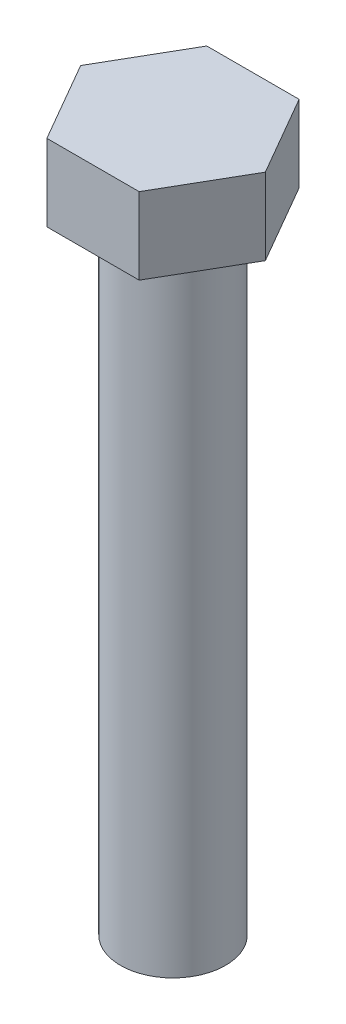
ISO-10303-21;
HEADER;
FILE_DESCRIPTION(('STEP AP214'),'2;1');
FILE_NAME('part.step','',(''),(''),'','','');
FILE_SCHEMA(('AUTOMOTIVE_DESIGN { 1 0 10303 214 1 1 1 1 }'));
ENDSEC;
DATA;
#1=APPLICATION_CONTEXT('core data for automotive mechanical design processes');
#2=APPLICATION_PROTOCOL_DEFINITION('international standard','automotive_design',2000,#1);
#3=PRODUCT_CONTEXT('',#1,'mechanical');
#4=PRODUCT('Part','Part','',(#3));
#5=PRODUCT_RELATED_PRODUCT_CATEGORY('part','',(#4));
#6=PRODUCT_DEFINITION_FORMATION('','',#4);
#7=PRODUCT_DEFINITION_CONTEXT('part definition',#1,'design');
#8=PRODUCT_DEFINITION('design','',#6,#7);
#9=PRODUCT_DEFINITION_SHAPE('','',#8);
#10=(LENGTH_UNIT() NAMED_UNIT(*) SI_UNIT(.MILLI.,.METRE.));
#11=(NAMED_UNIT(*) PLANE_ANGLE_UNIT() SI_UNIT($,.RADIAN.));
#12=(NAMED_UNIT(*) SI_UNIT($,.STERADIAN.) SOLID_ANGLE_UNIT());
#13=UNCERTAINTY_MEASURE_WITH_UNIT(LENGTH_MEASURE(1.E-05),#10,'distance_accuracy_value','');
#14=(GEOMETRIC_REPRESENTATION_CONTEXT(3) GLOBAL_UNCERTAINTY_ASSIGNED_CONTEXT((#13)) GLOBAL_UNIT_ASSIGNED_CONTEXT((#10,
#11,#12)) REPRESENTATION_CONTEXT('',''));
#15=CARTESIAN_POINT('',(0.,0.,0.));
#16=DIRECTION('',(0.,0.,1.));
#17=DIRECTION('',(1.,0.,0.));
#18=AXIS2_PLACEMENT_3D('',#15,#16,#17);
#19=CARTESIAN_POINT('',(-2.1975,3.65,3.80618164963261));
#20=DIRECTION('',(0.,0.,-1.));
#21=DIRECTION('',(-1.,0.,0.));
#22=AXIS2_PLACEMENT_3D('',#19,#20,#21);
#23=PLANE('',#22);
#24=DIRECTION('',(1.,0.,0.));
#25=VECTOR('',#24,1.);
#26=CARTESIAN_POINT('',(-2.1975,0.,3.80618164963261));
#27=LINE('',#26,#25);
#28=CARTESIAN_POINT('',(-2.1975,0.,3.80618164963261));
#29=VERTEX_POINT('',#28);
#30=CARTESIAN_POINT('',(2.1975,0.,3.80618164963261));
#31=VERTEX_POINT('',#30);
#32=EDGE_CURVE('E120',#29,#31,#27,.T.);
#33=ORIENTED_EDGE('',*,*,#32,.T.);
#34=DIRECTION('',(0.,-1.,0.));
#35=VECTOR('',#34,1.);
#36=CARTESIAN_POINT('',(2.1975,3.65,3.80618164963261));
#37=LINE('',#36,#35);
#38=CARTESIAN_POINT('',(2.1975,3.65,3.80618164963261));
#39=VERTEX_POINT('',#38);
#40=EDGE_CURVE('E37',#39,#31,#37,.T.);
#41=ORIENTED_EDGE('',*,*,#40,.F.);
#42=DIRECTION('',(1.,0.,0.));
#43=VECTOR('',#42,1.);
#44=CARTESIAN_POINT('',(-2.1975,3.65,3.80618164963261));
#45=LINE('',#44,#43);
#46=CARTESIAN_POINT('',(-2.1975,3.65,3.80618164963261));
#47=VERTEX_POINT('',#46);
#48=EDGE_CURVE('E131',#47,#39,#45,.T.);
#49=ORIENTED_EDGE('',*,*,#48,.F.);
#50=DIRECTION('',(0.,-1.,0.));
#51=VECTOR('',#50,1.);
#52=CARTESIAN_POINT('',(-2.1975,3.65,3.80618164963261));
#53=LINE('',#52,#51);
#54=EDGE_CURVE('E116',#47,#29,#53,.T.);
#55=ORIENTED_EDGE('',*,*,#54,.T.);
#56=EDGE_LOOP('',(#33,#41,#49,#55));
#57=FACE_BOUND('',#56,.T.);
#58=ADVANCED_FACE('F34',(#57),#23,.F.);
#59=CARTESIAN_POINT('',(2.1975,3.65,3.80618164963261));
#60=DIRECTION('',(-0.866025403784439,0.,-0.5));
#61=DIRECTION('',(-0.5,0.,0.866025403784439));
#62=AXIS2_PLACEMENT_3D('',#59,#60,#61);
#63=PLANE('',#62);
#64=DIRECTION('',(0.5,0.,-0.866025403784439));
#65=VECTOR('',#64,1.);
#66=CARTESIAN_POINT('',(2.1975,0.,3.80618164963261));
#67=LINE('',#66,#65);
#68=CARTESIAN_POINT('',(4.395,0.,0.));
#69=VERTEX_POINT('',#68);
#70=EDGE_CURVE('E123',#31,#69,#67,.T.);
#71=ORIENTED_EDGE('',*,*,#70,.T.);
#72=DIRECTION('',(0.,-1.,0.));
#73=VECTOR('',#72,1.);
#74=CARTESIAN_POINT('',(4.395,3.65,0.));
#75=LINE('',#74,#73);
#76=CARTESIAN_POINT('',(4.395,3.65,0.));
#77=VERTEX_POINT('',#76);
#78=EDGE_CURVE('E134',#77,#69,#75,.T.);
#79=ORIENTED_EDGE('',*,*,#78,.F.);
#80=DIRECTION('',(0.5,0.,-0.866025403784439));
#81=VECTOR('',#80,1.);
#82=CARTESIAN_POINT('',(2.1975,3.65,3.80618164963261));
#83=LINE('',#82,#81);
#84=EDGE_CURVE('E89',#39,#77,#83,.T.);
#85=ORIENTED_EDGE('',*,*,#84,.F.);
#86=ORIENTED_EDGE('',*,*,#40,.T.);
#87=EDGE_LOOP('',(#71,#79,#85,#86));
#88=FACE_BOUND('',#87,.T.);
#89=ADVANCED_FACE('F139',(#88),#63,.F.);
#90=CARTESIAN_POINT('',(4.395,3.65,0.));
#91=DIRECTION('',(-0.866025403784438,0.,0.5));
#92=DIRECTION('',(0.5,0.,0.866025403784439));
#93=AXIS2_PLACEMENT_3D('',#90,#91,#92);
#94=PLANE('',#93);
#95=DIRECTION('',(-0.5,0.,-0.866025403784438));
#96=VECTOR('',#95,1.);
#97=CARTESIAN_POINT('',(4.395,0.,0.));
#98=LINE('',#97,#96);
#99=CARTESIAN_POINT('',(2.1975,0.,-3.80618164963261));
#100=VERTEX_POINT('',#99);
#101=EDGE_CURVE('E126',#69,#100,#98,.T.);
#102=ORIENTED_EDGE('',*,*,#101,.T.);
#103=DIRECTION('',(0.,-1.,0.));
#104=VECTOR('',#103,1.);
#105=CARTESIAN_POINT('',(2.1975,3.65,-3.80618164963261));
#106=LINE('',#105,#104);
#107=CARTESIAN_POINT('',(2.1975,3.65,-3.80618164963261));
#108=VERTEX_POINT('',#107);
#109=EDGE_CURVE('E111',#108,#100,#106,.T.);
#110=ORIENTED_EDGE('',*,*,#109,.F.);
#111=DIRECTION('',(-0.5,0.,-0.866025403784438));
#112=VECTOR('',#111,1.);
#113=CARTESIAN_POINT('',(4.395,3.65,0.));
#114=LINE('',#113,#112);
#115=EDGE_CURVE('E102',#77,#108,#114,.T.);
#116=ORIENTED_EDGE('',*,*,#115,.F.);
#117=ORIENTED_EDGE('',*,*,#78,.T.);
#118=EDGE_LOOP('',(#102,#110,#116,#117));
#119=FACE_BOUND('',#118,.T.);
#120=ADVANCED_FACE('F145',(#119),#94,.F.);
#121=CARTESIAN_POINT('',(2.1975,3.65,-3.80618164963261));
#122=DIRECTION('',(0.,0.,1.));
#123=DIRECTION('',(1.,0.,0.));
#124=AXIS2_PLACEMENT_3D('',#121,#122,#123);
#125=PLANE('',#124);
#126=DIRECTION('',(-1.,0.,0.));
#127=VECTOR('',#126,1.);
#128=CARTESIAN_POINT('',(2.1975,0.,-3.80618164963261));
#129=LINE('',#128,#127);
#130=CARTESIAN_POINT('',(-2.1975,0.,-3.80618164963261));
#131=VERTEX_POINT('',#130);
#132=EDGE_CURVE('E110',#100,#131,#129,.T.);
#133=ORIENTED_EDGE('',*,*,#132,.T.);
#134=DIRECTION('',(0.,-1.,0.));
#135=VECTOR('',#134,1.);
#136=CARTESIAN_POINT('',(-2.1975,3.65,-3.80618164963261));
#137=LINE('',#136,#135);
#138=CARTESIAN_POINT('',(-2.1975,3.65,-3.80618164963261));
#139=VERTEX_POINT('',#138);
#140=EDGE_CURVE('E107',#139,#131,#137,.T.);
#141=ORIENTED_EDGE('',*,*,#140,.F.);
#142=DIRECTION('',(-1.,0.,0.));
#143=VECTOR('',#142,1.);
#144=CARTESIAN_POINT('',(2.1975,3.65,-3.80618164963261));
#145=LINE('',#144,#143);
#146=EDGE_CURVE('E96',#108,#139,#145,.T.);
#147=ORIENTED_EDGE('',*,*,#146,.F.);
#148=ORIENTED_EDGE('',*,*,#109,.T.);
#149=EDGE_LOOP('',(#133,#141,#147,#148));
#150=FACE_BOUND('',#149,.T.);
#151=ADVANCED_FACE('F108',(#150),#125,.F.);
#152=CARTESIAN_POINT('',(-2.1975,3.65,-3.80618164963261));
#153=DIRECTION('',(0.866025403784439,0.,0.5));
#154=DIRECTION('',(0.5,0.,-0.866025403784439));
#155=AXIS2_PLACEMENT_3D('',#152,#153,#154);
#156=PLANE('',#155);
#157=DIRECTION('',(-0.5,0.,0.866025403784439));
#158=VECTOR('',#157,1.);
#159=CARTESIAN_POINT('',(-2.1975,0.,-3.80618164963261));
#160=LINE('',#159,#158);
#161=CARTESIAN_POINT('',(-4.395,0.,0.));
#162=VERTEX_POINT('',#161);
#163=EDGE_CURVE('E74',#131,#162,#160,.T.);
#164=ORIENTED_EDGE('',*,*,#163,.T.);
#165=DIRECTION('',(0.,-1.,0.));
#166=VECTOR('',#165,1.);
#167=CARTESIAN_POINT('',(-4.395,3.65,0.));
#168=LINE('',#167,#166);
#169=CARTESIAN_POINT('',(-4.395,3.65,0.));
#170=VERTEX_POINT('',#169);
#171=EDGE_CURVE('E112',#170,#162,#168,.T.);
#172=ORIENTED_EDGE('',*,*,#171,.F.);
#173=DIRECTION('',(-0.5,0.,0.866025403784439));
#174=VECTOR('',#173,1.);
#175=CARTESIAN_POINT('',(-2.1975,3.65,-3.80618164963261));
#176=LINE('',#175,#174);
#177=EDGE_CURVE('E100',#139,#170,#176,.T.);
#178=ORIENTED_EDGE('',*,*,#177,.F.);
#179=ORIENTED_EDGE('',*,*,#140,.T.);
#180=EDGE_LOOP('',(#164,#172,#178,#179));
#181=FACE_BOUND('',#180,.T.);
#182=ADVANCED_FACE('F114',(#181),#156,.F.);
#183=CARTESIAN_POINT('',(-4.395,3.65,0.));
#184=DIRECTION('',(0.866025403784438,0.,-0.5));
#185=DIRECTION('',(-0.5,0.,-0.866025403784438));
#186=AXIS2_PLACEMENT_3D('',#183,#184,#185);
#187=PLANE('',#186);
#188=DIRECTION('',(0.5,0.,0.866025403784438));
#189=VECTOR('',#188,1.);
#190=CARTESIAN_POINT('',(-4.395,0.,0.));
#191=LINE('',#190,#189);
#192=EDGE_CURVE('E80',#162,#29,#191,.T.);
#193=ORIENTED_EDGE('',*,*,#192,.T.);
#194=ORIENTED_EDGE('',*,*,#54,.F.);
#195=DIRECTION('',(0.5,0.,0.866025403784438));
#196=VECTOR('',#195,1.);
#197=CARTESIAN_POINT('',(-4.395,3.65,0.));
#198=LINE('',#197,#196);
#199=EDGE_CURVE('E51',#170,#47,#198,.T.);
#200=ORIENTED_EDGE('',*,*,#199,.F.);
#201=ORIENTED_EDGE('',*,*,#171,.T.);
#202=EDGE_LOOP('',(#193,#194,#200,#201));
#203=FACE_BOUND('',#202,.T.);
#204=ADVANCED_FACE('F165',(#203),#187,.F.);
#205=CARTESIAN_POINT('',(0.,3.65,0.));
#206=DIRECTION('',(0.,1.,0.));
#207=DIRECTION('',(0.,0.,1.));
#208=AXIS2_PLACEMENT_3D('',#205,#206,#207);
#209=PLANE('',#208);
#210=ORIENTED_EDGE('',*,*,#48,.T.);
#211=ORIENTED_EDGE('',*,*,#84,.T.);
#212=ORIENTED_EDGE('',*,*,#115,.T.);
#213=ORIENTED_EDGE('',*,*,#146,.T.);
#214=ORIENTED_EDGE('',*,*,#177,.T.);
#215=ORIENTED_EDGE('',*,*,#199,.T.);
#216=EDGE_LOOP('',(#210,#211,#212,#213,#214,#215));
#217=FACE_BOUND('',#216,.T.);
#218=ADVANCED_FACE('F98',(#217),#209,.T.);
#219=CARTESIAN_POINT('',(0.,0.,0.));
#220=DIRECTION('',(0.,1.,0.));
#221=DIRECTION('',(0.,0.,1.));
#222=AXIS2_PLACEMENT_3D('',#219,#220,#221);
#223=PLANE('',#222);
#224=CARTESIAN_POINT('',(0.,0.,0.));
#225=DIRECTION('',(0.,-1.,0.));
#226=DIRECTION('',(0.,0.,-1.));
#227=AXIS2_PLACEMENT_3D('',#224,#225,#226);
#228=CIRCLE('',#227,2.5);
#229=CARTESIAN_POINT('',(0.,0.,-2.5));
#230=VERTEX_POINT('',#229);
#231=EDGE_CURVE('E11',#230,#230,#228,.T.);
#232=ORIENTED_EDGE('',*,*,#231,.F.);
#233=EDGE_LOOP('',(#232));
#234=FACE_BOUND('',#233,.T.);
#235=ORIENTED_EDGE('',*,*,#32,.F.);
#236=ORIENTED_EDGE('',*,*,#192,.F.);
#237=ORIENTED_EDGE('',*,*,#163,.F.);
#238=ORIENTED_EDGE('',*,*,#132,.F.);
#239=ORIENTED_EDGE('',*,*,#101,.F.);
#240=ORIENTED_EDGE('',*,*,#70,.F.);
#241=EDGE_LOOP('',(#235,#236,#237,#238,#239,#240));
#242=FACE_BOUND('',#241,.T.);
#243=ADVANCED_FACE('F144',(#234,#242),#223,.F.);
#244=CARTESIAN_POINT('',(0.,-30.,0.));
#245=DIRECTION('',(0.,1.,0.));
#246=DIRECTION('',(0.,0.,1.));
#247=AXIS2_PLACEMENT_3D('',#244,#245,#246);
#248=CYLINDRICAL_SURFACE('',#247,2.5);
#249=CARTESIAN_POINT('',(0.,-30.,0.));
#250=DIRECTION('',(0.,-1.,0.));
#251=DIRECTION('',(0.,0.,-1.));
#252=AXIS2_PLACEMENT_3D('',#249,#250,#251);
#253=CIRCLE('',#252,2.5);
#254=CARTESIAN_POINT('',(0.,-30.,-2.5));
#255=VERTEX_POINT('',#254);
#256=EDGE_CURVE('E124',#255,#255,#253,.T.);
#257=ORIENTED_EDGE('',*,*,#256,.F.);
#258=EDGE_LOOP('',(#257));
#259=FACE_BOUND('',#258,.T.);
#260=ORIENTED_EDGE('',*,*,#231,.T.);
#261=EDGE_LOOP('',(#260));
#262=FACE_BOUND('',#261,.T.);
#263=ADVANCED_FACE('F154',(#259,#262),#248,.T.);
#264=CARTESIAN_POINT('',(0.,-30.,0.));
#265=DIRECTION('',(0.,-1.,0.));
#266=DIRECTION('',(0.,0.,-1.));
#267=AXIS2_PLACEMENT_3D('',#264,#265,#266);
#268=PLANE('',#267);
#269=ORIENTED_EDGE('',*,*,#256,.T.);
#270=EDGE_LOOP('',(#269));
#271=FACE_BOUND('',#270,.T.);
#272=ADVANCED_FACE('F152',(#271),#268,.T.);
#273=CLOSED_SHELL('',(#58,#89,#120,#151,#182,#204,#218,#243,#263,#272));
#274=MANIFOLD_SOLID_BREP('B2',#273);
#275=ADVANCED_BREP_SHAPE_REPRESENTATION('',(#18,#274),#14);
#276=SHAPE_DEFINITION_REPRESENTATION(#9,#275);
ENDSEC;
END-ISO-10303-21;
